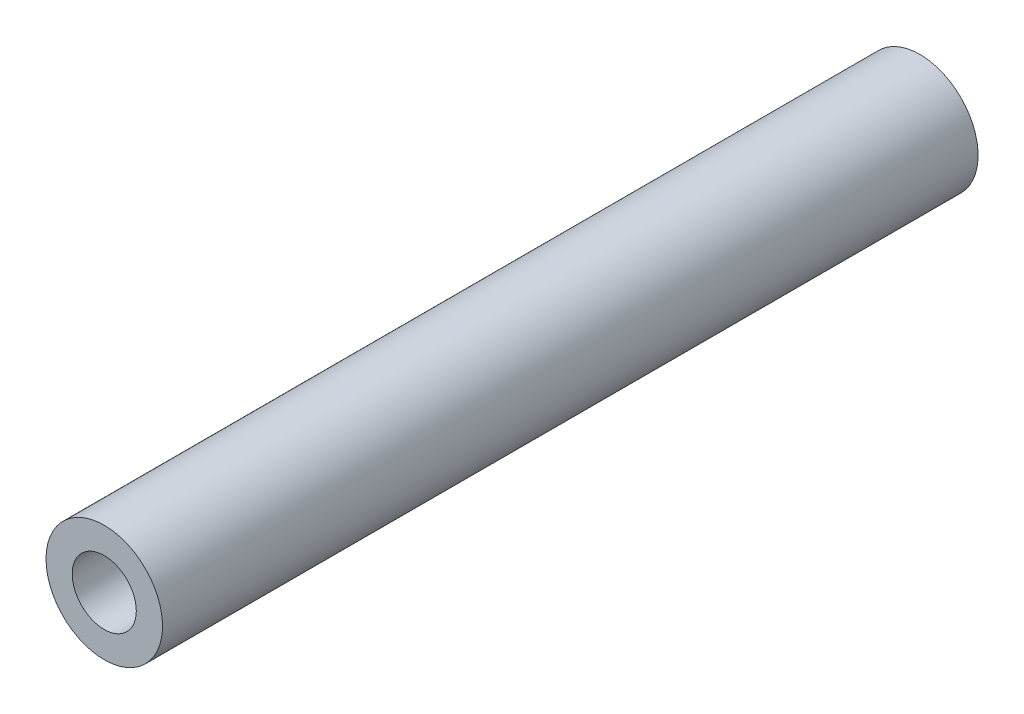
ISO-10303-21;
HEADER;
FILE_DESCRIPTION(('STEP AP214'),'2;1');
FILE_NAME('part.step','',(''),(''),'','','');
FILE_SCHEMA(('AUTOMOTIVE_DESIGN { 1 0 10303 214 1 1 1 1 }'));
ENDSEC;
DATA;
#1=APPLICATION_CONTEXT('core data for automotive mechanical design processes');
#2=APPLICATION_PROTOCOL_DEFINITION('international standard','automotive_design',2000,#1);
#3=PRODUCT_CONTEXT('',#1,'mechanical');
#4=PRODUCT('Part','Part','',(#3));
#5=PRODUCT_RELATED_PRODUCT_CATEGORY('part','',(#4));
#6=PRODUCT_DEFINITION_FORMATION('','',#4);
#7=PRODUCT_DEFINITION_CONTEXT('part definition',#1,'design');
#8=PRODUCT_DEFINITION('design','',#6,#7);
#9=PRODUCT_DEFINITION_SHAPE('','',#8);
#10=(LENGTH_UNIT() NAMED_UNIT(*) SI_UNIT(.MILLI.,.METRE.));
#11=(NAMED_UNIT(*) PLANE_ANGLE_UNIT() SI_UNIT($,.RADIAN.));
#12=(NAMED_UNIT(*) SI_UNIT($,.STERADIAN.) SOLID_ANGLE_UNIT());
#13=UNCERTAINTY_MEASURE_WITH_UNIT(LENGTH_MEASURE(1.E-05),#10,'distance_accuracy_value','');
#14=(GEOMETRIC_REPRESENTATION_CONTEXT(3) GLOBAL_UNCERTAINTY_ASSIGNED_CONTEXT((#13)) GLOBAL_UNIT_ASSIGNED_CONTEXT((#10,
#11,#12)) REPRESENTATION_CONTEXT('',''));
#15=CARTESIAN_POINT('',(0.,0.,0.));
#16=DIRECTION('',(0.,0.,1.));
#17=DIRECTION('',(1.,0.,0.));
#18=AXIS2_PLACEMENT_3D('',#15,#16,#17);
#19=CARTESIAN_POINT('',(0.,0.,42.));
#20=DIRECTION('',(0.,0.,-1.));
#21=DIRECTION('',(-1.,0.,0.));
#22=AXIS2_PLACEMENT_3D('',#19,#20,#21);
#23=CYLINDRICAL_SURFACE('',#22,3.);
#24=CARTESIAN_POINT('',(0.,0.,42.));
#25=DIRECTION('',(0.,0.,1.));
#26=DIRECTION('',(1.,0.,0.));
#27=AXIS2_PLACEMENT_3D('',#24,#25,#26);
#28=CIRCLE('',#27,3.);
#29=CARTESIAN_POINT('',(-3.,0.,42.));
#30=VERTEX_POINT('',#29);
#31=EDGE_CURVE('E10',#30,#30,#28,.T.);
#32=CARTESIAN_POINT('',(0.,0.,0.));
#33=DIRECTION('',(0.,0.,1.));
#34=DIRECTION('',(1.,0.,0.));
#35=AXIS2_PLACEMENT_3D('',#32,#33,#34);
#36=CIRCLE('',#35,3.);
#37=CARTESIAN_POINT('',(-3.,0.,0.));
#38=VERTEX_POINT('',#37);
#39=EDGE_CURVE('E46',#38,#38,#36,.T.);
#40=CARTESIAN_POINT('',(-3.,0.,42.));
#41=CARTESIAN_POINT('',(-3.,0.,41.5625));
#42=CARTESIAN_POINT('',(-3.,0.,41.125));
#43=CARTESIAN_POINT('',(-3.,0.,40.25));
#44=CARTESIAN_POINT('',(-3.,0.,39.8125));
#45=CARTESIAN_POINT('',(-3.,0.,38.9375));
#46=CARTESIAN_POINT('',(-3.,0.,38.5));
#47=CARTESIAN_POINT('',(-3.,0.,37.625));
#48=CARTESIAN_POINT('',(-3.,0.,37.1875));
#49=CARTESIAN_POINT('',(-3.,0.,36.3125));
#50=CARTESIAN_POINT('',(-3.,0.,35.875));
#51=CARTESIAN_POINT('',(-3.,0.,35.));
#52=CARTESIAN_POINT('',(-3.,0.,34.5625));
#53=CARTESIAN_POINT('',(-3.,0.,33.6875));
#54=CARTESIAN_POINT('',(-3.,0.,33.25));
#55=CARTESIAN_POINT('',(-3.,0.,32.375));
#56=CARTESIAN_POINT('',(-3.,0.,31.9375));
#57=CARTESIAN_POINT('',(-3.,0.,31.0625));
#58=CARTESIAN_POINT('',(-3.,0.,30.625));
#59=CARTESIAN_POINT('',(-3.,0.,29.75));
#60=CARTESIAN_POINT('',(-3.,0.,29.3125));
#61=CARTESIAN_POINT('',(-3.,0.,28.4375));
#62=CARTESIAN_POINT('',(-3.,0.,28.));
#63=CARTESIAN_POINT('',(-3.,0.,27.125));
#64=CARTESIAN_POINT('',(-3.,0.,26.6875));
#65=CARTESIAN_POINT('',(-3.,0.,25.8125));
#66=CARTESIAN_POINT('',(-3.,0.,25.375));
#67=CARTESIAN_POINT('',(-3.,0.,24.5));
#68=CARTESIAN_POINT('',(-3.,0.,24.0625));
#69=CARTESIAN_POINT('',(-3.,0.,23.1875));
#70=CARTESIAN_POINT('',(-3.,0.,22.75));
#71=CARTESIAN_POINT('',(-3.,0.,21.875));
#72=CARTESIAN_POINT('',(-3.,0.,21.4375));
#73=CARTESIAN_POINT('',(-3.,0.,20.5625));
#74=CARTESIAN_POINT('',(-3.,0.,20.125));
#75=CARTESIAN_POINT('',(-3.,0.,19.25));
#76=CARTESIAN_POINT('',(-3.,0.,18.8125));
#77=CARTESIAN_POINT('',(-3.,0.,17.9375));
#78=CARTESIAN_POINT('',(-3.,0.,17.5));
#79=CARTESIAN_POINT('',(-3.,0.,16.625));
#80=CARTESIAN_POINT('',(-3.,0.,16.1875));
#81=CARTESIAN_POINT('',(-3.,0.,15.3125));
#82=CARTESIAN_POINT('',(-3.,0.,14.875));
#83=CARTESIAN_POINT('',(-3.,0.,14.));
#84=CARTESIAN_POINT('',(-3.,0.,13.5625));
#85=CARTESIAN_POINT('',(-3.,0.,12.6875));
#86=CARTESIAN_POINT('',(-3.,0.,12.25));
#87=CARTESIAN_POINT('',(-3.,0.,11.375));
#88=CARTESIAN_POINT('',(-3.,0.,10.9375));
#89=CARTESIAN_POINT('',(-3.,0.,10.0625));
#90=CARTESIAN_POINT('',(-3.,0.,9.625));
#91=CARTESIAN_POINT('',(-3.,0.,8.75));
#92=CARTESIAN_POINT('',(-3.,0.,8.3125));
#93=CARTESIAN_POINT('',(-3.,0.,7.4375));
#94=CARTESIAN_POINT('',(-3.,0.,7.));
#95=CARTESIAN_POINT('',(-3.,0.,6.125));
#96=CARTESIAN_POINT('',(-3.,0.,5.6875));
#97=CARTESIAN_POINT('',(-3.,0.,4.8125));
#98=CARTESIAN_POINT('',(-3.,0.,4.375));
#99=CARTESIAN_POINT('',(-3.,0.,3.5));
#100=CARTESIAN_POINT('',(-3.,0.,3.0625));
#101=CARTESIAN_POINT('',(-3.,0.,2.1875));
#102=CARTESIAN_POINT('',(-3.,0.,1.75));
#103=CARTESIAN_POINT('',(-3.,0.,0.875000000000001));
#104=CARTESIAN_POINT('',(-3.,0.,0.4375));
#105=CARTESIAN_POINT('',(-3.,0.,0.));
#106=B_SPLINE_CURVE_WITH_KNOTS('',3,(#40,#41,#42,#43,#44,#45,#46,#47,#48,#49,#50,#51,#52,#53,
#54,#55,#56,#57,#58,#59,#60,#61,#62,#63,#64,#65,#66,#67,#68,#69,#70,#71,#72,#73,#74,#75,#76,#77,
#78,#79,#80,#81,#82,#83,#84,#85,#86,#87,#88,#89,#90,#91,#92,#93,#94,#95,#96,#97,#98,#99,#100,
#101,#102,#103,#104,#105),.UNSPECIFIED.,.F.,.F.,(4,2,2,2,2,2,2,2,2,2,2,2,2,2,2,2,2,2,2,2,2,2,2,
2,2,2,2,2,2,2,2,2,4),(0.,1.31249999999999,2.625,3.9375,5.25,6.5625,7.87499999999999,
9.18749999999999,10.5,11.8125,13.125,14.4375,15.75,17.0625,18.375,19.6875,21.,22.3125,23.625,
24.9375,26.25,27.5625,28.875,30.1875,31.5,32.8125,34.125,35.4375,36.75,38.0625,39.375,40.6875,
42.),.UNSPECIFIED.);
#107=EDGE_CURVE('BSEAM43',#30,#38,#106,.T.);
#108=ORIENTED_EDGE('',*,*,#31,.F.);
#109=ORIENTED_EDGE('',*,*,#39,.T.);
#110=ORIENTED_EDGE('',*,*,#107,.T.);
#111=ORIENTED_EDGE('',*,*,#107,.F.);
#112=EDGE_LOOP('',(#108,#110,#109,#111));
#113=FACE_BOUND('',#112,.T.);
#114=ADVANCED_FACE('F43',(#113),#23,.T.);
#115=CARTESIAN_POINT('',(0.,0.,42.));
#116=DIRECTION('',(0.,0.,1.));
#117=DIRECTION('',(1.,0.,0.));
#118=AXIS2_PLACEMENT_3D('',#115,#116,#117);
#119=PLANE('',#118);
#120=CARTESIAN_POINT('',(0.,0.,42.));
#121=DIRECTION('',(0.,0.,1.));
#122=DIRECTION('',(1.,0.,0.));
#123=AXIS2_PLACEMENT_3D('',#120,#121,#122);
#124=CIRCLE('',#123,1.65);
#125=CARTESIAN_POINT('',(1.65,0.,42.));
#126=VERTEX_POINT('',#125);
#127=EDGE_CURVE('E57',#126,#126,#124,.T.);
#128=ORIENTED_EDGE('',*,*,#127,.F.);
#129=EDGE_LOOP('',(#128));
#130=FACE_BOUND('',#129,.T.);
#131=ORIENTED_EDGE('',*,*,#31,.T.);
#132=EDGE_LOOP('',(#131));
#133=FACE_BOUND('',#132,.T.);
#134=ADVANCED_FACE('F63',(#130,#133),#119,.T.);
#135=CARTESIAN_POINT('',(0.,0.,0.));
#136=DIRECTION('',(0.,0.,1.));
#137=DIRECTION('',(1.,0.,0.));
#138=AXIS2_PLACEMENT_3D('',#135,#136,#137);
#139=PLANE('',#138);
#140=CARTESIAN_POINT('',(0.,0.,0.));
#141=DIRECTION('',(0.,0.,1.));
#142=DIRECTION('',(1.,0.,0.));
#143=AXIS2_PLACEMENT_3D('',#140,#141,#142);
#144=CIRCLE('',#143,1.64999999999999);
#145=CARTESIAN_POINT('',(1.64999999999999,0.,0.));
#146=VERTEX_POINT('',#145);
#147=EDGE_CURVE('E53',#146,#146,#144,.T.);
#148=ORIENTED_EDGE('',*,*,#147,.T.);
#149=EDGE_LOOP('',(#148));
#150=FACE_BOUND('',#149,.T.);
#151=ORIENTED_EDGE('',*,*,#39,.F.);
#152=EDGE_LOOP('',(#151));
#153=FACE_BOUND('',#152,.T.);
#154=ADVANCED_FACE('F65',(#150,#153),#139,.F.);
#155=CARTESIAN_POINT('',(0.,0.,42.));
#156=DIRECTION('',(0.,0.,1.));
#157=DIRECTION('',(1.,0.,0.));
#158=AXIS2_PLACEMENT_3D('',#155,#156,#157);
#159=CYLINDRICAL_SURFACE('',#158,1.64999999999999);
#160=ORIENTED_EDGE('',*,*,#147,.F.);
#161=EDGE_LOOP('',(#160));
#162=FACE_BOUND('',#161,.T.);
#163=ORIENTED_EDGE('',*,*,#127,.T.);
#164=EDGE_LOOP('',(#163));
#165=FACE_BOUND('',#164,.T.);
#166=ADVANCED_FACE('F61',(#162,#165),#159,.F.);
#167=CLOSED_SHELL('',(#114,#134,#154,#166));
#168=MANIFOLD_SOLID_BREP('B2',#167);
#169=ADVANCED_BREP_SHAPE_REPRESENTATION('',(#18,#168),#14);
#170=SHAPE_DEFINITION_REPRESENTATION(#9,#169);
ENDSEC;
END-ISO-10303-21;
